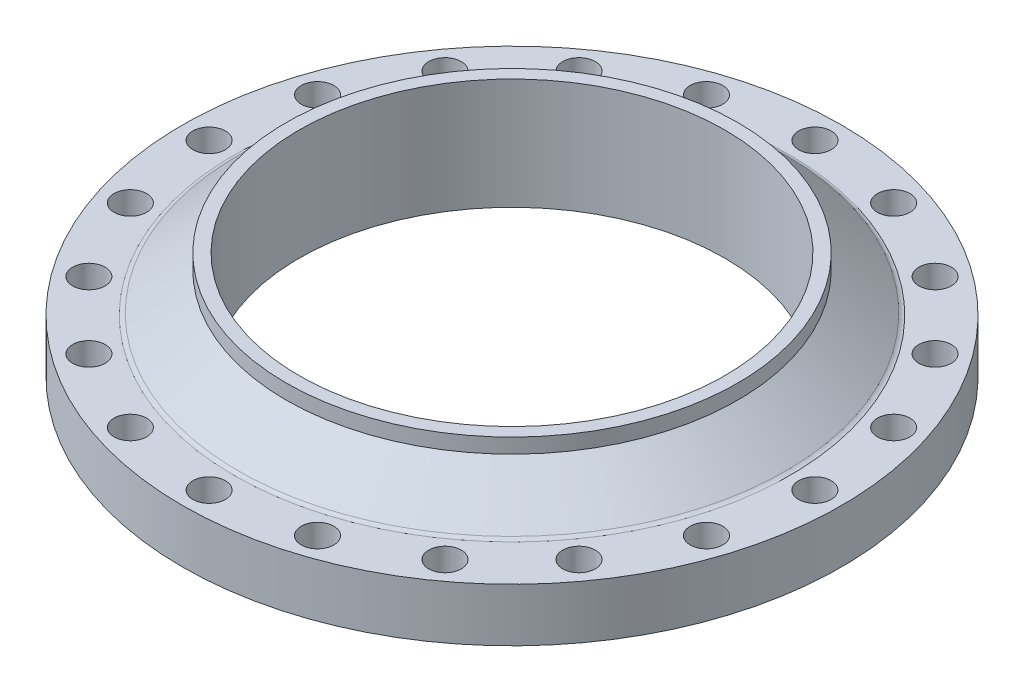
ISO-10303-21;
HEADER;
FILE_DESCRIPTION(('STEP AP214'),'2;1');
FILE_NAME('part.step','',(''),(''),'','','');
FILE_SCHEMA(('AUTOMOTIVE_DESIGN { 1 0 10303 214 1 1 1 1 }'));
ENDSEC;
DATA;
#1=APPLICATION_CONTEXT('core data for automotive mechanical design processes');
#2=APPLICATION_PROTOCOL_DEFINITION('international standard','automotive_design',2000,#1);
#3=PRODUCT_CONTEXT('',#1,'mechanical');
#4=PRODUCT('Part','Part','',(#3));
#5=PRODUCT_RELATED_PRODUCT_CATEGORY('part','',(#4));
#6=PRODUCT_DEFINITION_FORMATION('','',#4);
#7=PRODUCT_DEFINITION_CONTEXT('part definition',#1,'design');
#8=PRODUCT_DEFINITION('design','',#6,#7);
#9=PRODUCT_DEFINITION_SHAPE('','',#8);
#10=(LENGTH_UNIT() NAMED_UNIT(*) SI_UNIT(.MILLI.,.METRE.));
#11=(NAMED_UNIT(*) PLANE_ANGLE_UNIT() SI_UNIT($,.RADIAN.));
#12=(NAMED_UNIT(*) SI_UNIT($,.STERADIAN.) SOLID_ANGLE_UNIT());
#13=UNCERTAINTY_MEASURE_WITH_UNIT(LENGTH_MEASURE(1.E-05),#10,'distance_accuracy_value','');
#14=(GEOMETRIC_REPRESENTATION_CONTEXT(3) GLOBAL_UNCERTAINTY_ASSIGNED_CONTEXT((#13)) GLOBAL_UNIT_ASSIGNED_CONTEXT((#10,
#11,#12)) REPRESENTATION_CONTEXT('',''));
#15=CARTESIAN_POINT('',(0.,0.,0.));
#16=DIRECTION('',(0.,0.,1.));
#17=DIRECTION('',(1.,0.,0.));
#18=AXIS2_PLACEMENT_3D('',#15,#16,#17);
#19=CARTESIAN_POINT('',(-348.81739370403,77.,-2.43577884156304E-12));
#20=DIRECTION('',(0.,1.,0.));
#21=DIRECTION('',(0.,0.,1.));
#22=AXIS2_PLACEMENT_3D('',#19,#20,#21);
#23=PLANE('',#22);
#24=CARTESIAN_POINT('',(388.982115164719,77.,-126.387950699348));
#25=DIRECTION('',(0.,1.,0.));
#26=DIRECTION('',(0.,0.,1.));
#27=AXIS2_PLACEMENT_3D('',#24,#25,#26);
#28=CIRCLE('',#27,22.);
#29=CARTESIAN_POINT('',(388.982115164719,77.,-104.387950699348));
#30=VERTEX_POINT('',#29);
#31=EDGE_CURVE('E119',#30,#30,#28,.T.);
#32=ORIENTED_EDGE('',*,*,#31,.F.);
#33=EDGE_LOOP('',(#32));
#34=FACE_BOUND('',#33,.T.);
#35=CARTESIAN_POINT('',(330.887950699357,77.,-240.404168187617));
#36=DIRECTION('',(0.,1.,0.));
#37=DIRECTION('',(0.,0.,1.));
#38=AXIS2_PLACEMENT_3D('',#35,#36,#37);
#39=CIRCLE('',#38,22.);
#40=CARTESIAN_POINT('',(330.887950699357,77.,-218.404168187617));
#41=VERTEX_POINT('',#40);
#42=EDGE_CURVE('E116',#41,#41,#39,.T.);
#43=ORIENTED_EDGE('',*,*,#42,.F.);
#44=EDGE_LOOP('',(#43));
#45=FACE_BOUND('',#44,.T.);
#46=CARTESIAN_POINT('',(240.404168187626,77.,-330.88795069935));
#47=DIRECTION('',(0.,1.,0.));
#48=DIRECTION('',(0.,0.,1.));
#49=AXIS2_PLACEMENT_3D('',#46,#47,#48);
#50=CIRCLE('',#49,22.);
#51=CARTESIAN_POINT('',(240.404168187626,77.,-308.88795069935));
#52=VERTEX_POINT('',#51);
#53=EDGE_CURVE('E113',#52,#52,#50,.T.);
#54=ORIENTED_EDGE('',*,*,#53,.F.);
#55=EDGE_LOOP('',(#54));
#56=FACE_BOUND('',#55,.T.);
#57=CARTESIAN_POINT('',(126.387950699358,77.,-388.982115164716));
#58=DIRECTION('',(0.,1.,0.));
#59=DIRECTION('',(0.,0.,1.));
#60=AXIS2_PLACEMENT_3D('',#57,#58,#59);
#61=CIRCLE('',#60,22.);
#62=CARTESIAN_POINT('',(126.387950699358,77.,-366.982115164716));
#63=VERTEX_POINT('',#62);
#64=EDGE_CURVE('E109',#63,#63,#61,.T.);
#65=ORIENTED_EDGE('',*,*,#64,.F.);
#66=EDGE_LOOP('',(#65));
#67=FACE_BOUND('',#66,.T.);
#68=CARTESIAN_POINT('',(4.28404760276052E-12,77.,-409.));
#69=DIRECTION('',(0.,1.,0.));
#70=DIRECTION('',(0.,0.,1.));
#71=AXIS2_PLACEMENT_3D('',#68,#69,#70);
#72=CIRCLE('',#71,22.);
#73=CARTESIAN_POINT('',(4.28404760276052E-12,77.,-387.));
#74=VERTEX_POINT('',#73);
#75=EDGE_CURVE('E105',#74,#74,#72,.T.);
#76=ORIENTED_EDGE('',*,*,#75,.F.);
#77=EDGE_LOOP('',(#76));
#78=FACE_BOUND('',#77,.T.);
#79=CARTESIAN_POINT('',(-126.38795069935,77.,-388.982115164719));
#80=DIRECTION('',(0.,1.,0.));
#81=DIRECTION('',(0.,0.,1.));
#82=AXIS2_PLACEMENT_3D('',#79,#80,#81);
#83=CIRCLE('',#82,22.);
#84=CARTESIAN_POINT('',(-126.38795069935,77.,-366.982115164719));
#85=VERTEX_POINT('',#84);
#86=EDGE_CURVE('E101',#85,#85,#83,.T.);
#87=ORIENTED_EDGE('',*,*,#86,.F.);
#88=EDGE_LOOP('',(#87));
#89=FACE_BOUND('',#88,.T.);
#90=CARTESIAN_POINT('',(-240.404168187618,77.,-330.887950699356));
#91=DIRECTION('',(0.,1.,0.));
#92=DIRECTION('',(0.,0.,1.));
#93=AXIS2_PLACEMENT_3D('',#90,#91,#92);
#94=CIRCLE('',#93,22.);
#95=CARTESIAN_POINT('',(-240.404168187618,77.,-308.887950699356));
#96=VERTEX_POINT('',#95);
#97=EDGE_CURVE('E97',#96,#96,#94,.T.);
#98=ORIENTED_EDGE('',*,*,#97,.F.);
#99=EDGE_LOOP('',(#98));
#100=FACE_BOUND('',#99,.T.);
#101=CARTESIAN_POINT('',(-330.887950699351,77.,-240.404168187624));
#102=DIRECTION('',(0.,1.,0.));
#103=DIRECTION('',(0.,0.,1.));
#104=AXIS2_PLACEMENT_3D('',#101,#102,#103);
#105=CIRCLE('',#104,22.);
#106=CARTESIAN_POINT('',(-330.887950699351,77.,-218.404168187624));
#107=VERTEX_POINT('',#106);
#108=EDGE_CURVE('E93',#107,#107,#105,.T.);
#109=ORIENTED_EDGE('',*,*,#108,.F.);
#110=EDGE_LOOP('',(#109));
#111=FACE_BOUND('',#110,.T.);
#112=CARTESIAN_POINT('',(-388.982115164717,77.,-126.387950699357));
#113=DIRECTION('',(0.,1.,0.));
#114=DIRECTION('',(0.,0.,1.));
#115=AXIS2_PLACEMENT_3D('',#112,#113,#114);
#116=CIRCLE('',#115,22.);
#117=CARTESIAN_POINT('',(-388.982115164717,77.,-104.387950699357));
#118=VERTEX_POINT('',#117);
#119=EDGE_CURVE('E89',#118,#118,#116,.T.);
#120=ORIENTED_EDGE('',*,*,#119,.F.);
#121=EDGE_LOOP('',(#120));
#122=FACE_BOUND('',#121,.T.);
#123=CARTESIAN_POINT('',(-409.,77.,-2.85603173517368E-12));
#124=DIRECTION('',(0.,1.,0.));
#125=DIRECTION('',(0.,0.,1.));
#126=AXIS2_PLACEMENT_3D('',#123,#124,#125);
#127=CIRCLE('',#126,22.);
#128=CARTESIAN_POINT('',(-409.,77.,21.9999999999972));
#129=VERTEX_POINT('',#128);
#130=EDGE_CURVE('E85',#129,#129,#127,.T.);
#131=ORIENTED_EDGE('',*,*,#130,.F.);
#132=EDGE_LOOP('',(#131));
#133=FACE_BOUND('',#132,.T.);
#134=CARTESIAN_POINT('',(-388.982115164719,77.,126.387950699351));
#135=DIRECTION('',(0.,1.,0.));
#136=DIRECTION('',(0.,0.,1.));
#137=AXIS2_PLACEMENT_3D('',#134,#135,#136);
#138=CIRCLE('',#137,22.);
#139=CARTESIAN_POINT('',(-388.982115164719,77.,148.387950699351));
#140=VERTEX_POINT('',#139);
#141=EDGE_CURVE('E81',#140,#140,#138,.T.);
#142=ORIENTED_EDGE('',*,*,#141,.F.);
#143=EDGE_LOOP('',(#142));
#144=FACE_BOUND('',#143,.T.);
#145=CARTESIAN_POINT('',(-330.887950699355,77.,240.40416818762));
#146=DIRECTION('',(0.,1.,0.));
#147=DIRECTION('',(0.,0.,1.));
#148=AXIS2_PLACEMENT_3D('',#145,#146,#147);
#149=CIRCLE('',#148,22.);
#150=CARTESIAN_POINT('',(-330.887950699355,77.,262.40416818762));
#151=VERTEX_POINT('',#150);
#152=EDGE_CURVE('E77',#151,#151,#149,.T.);
#153=ORIENTED_EDGE('',*,*,#152,.F.);
#154=EDGE_LOOP('',(#153));
#155=FACE_BOUND('',#154,.T.);
#156=CARTESIAN_POINT('',(-240.404168187623,77.,330.887950699352));
#157=DIRECTION('',(0.,1.,0.));
#158=DIRECTION('',(0.,0.,1.));
#159=AXIS2_PLACEMENT_3D('',#156,#157,#158);
#160=CIRCLE('',#159,22.);
#161=CARTESIAN_POINT('',(-240.404168187623,77.,352.887950699352));
#162=VERTEX_POINT('',#161);
#163=EDGE_CURVE('E73',#162,#162,#160,.T.);
#164=ORIENTED_EDGE('',*,*,#163,.F.);
#165=EDGE_LOOP('',(#164));
#166=FACE_BOUND('',#165,.T.);
#167=CARTESIAN_POINT('',(-126.387950699355,77.,388.982115164717));
#168=DIRECTION('',(0.,1.,0.));
#169=DIRECTION('',(0.,0.,1.));
#170=AXIS2_PLACEMENT_3D('',#167,#168,#169);
#171=CIRCLE('',#170,22.);
#172=CARTESIAN_POINT('',(-126.387950699355,77.,410.982115164717));
#173=VERTEX_POINT('',#172);
#174=EDGE_CURVE('E69',#173,#173,#171,.T.);
#175=ORIENTED_EDGE('',*,*,#174,.F.);
#176=EDGE_LOOP('',(#175));
#177=FACE_BOUND('',#176,.T.);
#178=CARTESIAN_POINT('',(-1.42801586758684E-12,77.,409.));
#179=DIRECTION('',(0.,1.,0.));
#180=DIRECTION('',(0.,0.,1.));
#181=AXIS2_PLACEMENT_3D('',#178,#179,#180);
#182=CIRCLE('',#181,22.);
#183=CARTESIAN_POINT('',(-1.42801586758684E-12,77.,431.));
#184=VERTEX_POINT('',#183);
#185=EDGE_CURVE('E65',#184,#184,#182,.T.);
#186=ORIENTED_EDGE('',*,*,#185,.F.);
#187=EDGE_LOOP('',(#186));
#188=FACE_BOUND('',#187,.T.);
#189=CARTESIAN_POINT('',(126.387950699352,77.,388.982115164718));
#190=DIRECTION('',(0.,1.,0.));
#191=DIRECTION('',(0.,0.,1.));
#192=AXIS2_PLACEMENT_3D('',#189,#190,#191);
#193=CIRCLE('',#192,22.);
#194=CARTESIAN_POINT('',(126.387950699352,77.,410.982115164718));
#195=VERTEX_POINT('',#194);
#196=EDGE_CURVE('E61',#195,#195,#193,.T.);
#197=ORIENTED_EDGE('',*,*,#196,.F.);
#198=EDGE_LOOP('',(#197));
#199=FACE_BOUND('',#198,.T.);
#200=CARTESIAN_POINT('',(240.404168187621,77.,330.887950699354));
#201=DIRECTION('',(0.,1.,0.));
#202=DIRECTION('',(0.,0.,1.));
#203=AXIS2_PLACEMENT_3D('',#200,#201,#202);
#204=CIRCLE('',#203,22.);
#205=CARTESIAN_POINT('',(240.404168187621,77.,352.887950699354));
#206=VERTEX_POINT('',#205);
#207=EDGE_CURVE('E57',#206,#206,#204,.T.);
#208=ORIENTED_EDGE('',*,*,#207,.F.);
#209=EDGE_LOOP('',(#208));
#210=FACE_BOUND('',#209,.T.);
#211=CARTESIAN_POINT('',(330.887950699353,77.,240.404168187622));
#212=DIRECTION('',(0.,1.,0.));
#213=DIRECTION('',(0.,0.,1.));
#214=AXIS2_PLACEMENT_3D('',#211,#212,#213);
#215=CIRCLE('',#214,22.);
#216=CARTESIAN_POINT('',(330.887950699353,77.,262.404168187622));
#217=VERTEX_POINT('',#216);
#218=EDGE_CURVE('E53',#217,#217,#215,.T.);
#219=ORIENTED_EDGE('',*,*,#218,.F.);
#220=EDGE_LOOP('',(#219));
#221=FACE_BOUND('',#220,.T.);
#222=CARTESIAN_POINT('',(388.982115164718,77.,126.387950699354));
#223=DIRECTION('',(0.,1.,0.));
#224=DIRECTION('',(0.,0.,1.));
#225=AXIS2_PLACEMENT_3D('',#222,#223,#224);
#226=CIRCLE('',#225,22.);
#227=CARTESIAN_POINT('',(388.982115164718,77.,148.387950699354));
#228=VERTEX_POINT('',#227);
#229=EDGE_CURVE('E49',#228,#228,#226,.T.);
#230=ORIENTED_EDGE('',*,*,#229,.F.);
#231=EDGE_LOOP('',(#230));
#232=FACE_BOUND('',#231,.T.);
#233=CARTESIAN_POINT('',(409.,77.,0.));
#234=DIRECTION('',(0.,1.,0.));
#235=DIRECTION('',(0.,0.,1.));
#236=AXIS2_PLACEMENT_3D('',#233,#234,#235);
#237=CIRCLE('',#236,22.);
#238=CARTESIAN_POINT('',(409.,77.,22.));
#239=VERTEX_POINT('',#238);
#240=EDGE_CURVE('E48',#239,#239,#237,.T.);
#241=ORIENTED_EDGE('',*,*,#240,.F.);
#242=EDGE_LOOP('',(#241));
#243=FACE_BOUND('',#242,.T.);
#244=CARTESIAN_POINT('',(0.,77.,0.));
#245=DIRECTION('',(0.,-1.,0.));
#246=DIRECTION('',(0.,0.,-1.));
#247=AXIS2_PLACEMENT_3D('',#244,#245,#246);
#248=CIRCLE('',#247,375.);
#249=CARTESIAN_POINT('',(0.,77.,-375.));
#250=VERTEX_POINT('',#249);
#251=EDGE_CURVE('E10',#250,#250,#248,.T.);
#252=ORIENTED_EDGE('',*,*,#251,.T.);
#253=EDGE_LOOP('',(#252));
#254=FACE_BOUND('',#253,.T.);
#255=CARTESIAN_POINT('',(0.,77.,0.));
#256=DIRECTION('',(0.,-1.,0.));
#257=DIRECTION('',(0.,0.,-1.));
#258=AXIS2_PLACEMENT_3D('',#255,#256,#257);
#259=CIRCLE('',#258,445.);
#260=CARTESIAN_POINT('',(0.,77.,-445.));
#261=VERTEX_POINT('',#260);
#262=EDGE_CURVE('E166',#261,#261,#259,.T.);
#263=ORIENTED_EDGE('',*,*,#262,.F.);
#264=EDGE_LOOP('',(#263));
#265=FACE_BOUND('',#264,.T.);
#266=ADVANCED_FACE('F29',(#34,#45,#56,#67,#78,#89,#100,#111,#122,#133,#144,#155,#166,#177,#188,
#199,#210,#221,#232,#243,#254,#265),#23,.T.);
#267=CARTESIAN_POINT('',(0.,88.8743835950894,0.));
#268=DIRECTION('',(0.,-1.,0.));
#269=DIRECTION('',(0.,0.,-1.));
#270=AXIS2_PLACEMENT_3D('',#267,#268,#269);
#271=TOROIDAL_SURFACE('',#270,376.731766218827,12.);
#272=CARTESIAN_POINT('',(0.,79.4292405892214,0.));
#273=DIRECTION('',(0.,-1.,0.));
#274=DIRECTION('',(0.,0.,-1.));
#275=AXIS2_PLACEMENT_3D('',#272,#273,#274);
#276=CIRCLE('',#275,369.329788537241);
#277=CARTESIAN_POINT('',(0.,79.4292405892214,-369.329788537241));
#278=VERTEX_POINT('',#277);
#279=EDGE_CURVE('E36',#278,#278,#276,.T.);
#280=ORIENTED_EDGE('',*,*,#279,.T.);
#281=EDGE_LOOP('',(#280));
#282=FACE_BOUND('',#281,.T.);
#283=ORIENTED_EDGE('',*,*,#251,.F.);
#284=EDGE_LOOP('',(#283));
#285=FACE_BOUND('',#284,.T.);
#286=ADVANCED_FACE('F221',(#282,#285),#271,.F.);
#287=CARTESIAN_POINT('',(0.,130.,0.));
#288=DIRECTION('',(0.,-1.,0.));
#289=DIRECTION('',(0.,0.,-1.));
#290=AXIS2_PLACEMENT_3D('',#287,#288,#289);
#291=CONICAL_SURFACE('',#290,304.8,0.90608559937454);
#292=ORIENTED_EDGE('',*,*,#279,.F.);
#293=EDGE_LOOP('',(#292));
#294=FACE_BOUND('',#293,.T.);
#295=CARTESIAN_POINT('',(0.,130.,0.));
#296=DIRECTION('',(0.,-1.,0.));
#297=DIRECTION('',(0.,0.,-1.));
#298=AXIS2_PLACEMENT_3D('',#295,#296,#297);
#299=CIRCLE('',#298,304.8);
#300=CARTESIAN_POINT('',(0.,130.,-304.8));
#301=VERTEX_POINT('',#300);
#302=EDGE_CURVE('E41',#301,#301,#299,.T.);
#303=ORIENTED_EDGE('',*,*,#302,.T.);
#304=EDGE_LOOP('',(#303));
#305=FACE_BOUND('',#304,.T.);
#306=ADVANCED_FACE('F189',(#294,#305),#291,.T.);
#307=CARTESIAN_POINT('',(0.,92.0971254355401,0.));
#308=DIRECTION('',(0.,-1.,0.));
#309=DIRECTION('',(0.,0.,-1.));
#310=AXIS2_PLACEMENT_3D('',#307,#308,#309);
#311=CYLINDRICAL_SURFACE('',#310,304.8);
#312=ORIENTED_EDGE('',*,*,#302,.F.);
#313=EDGE_LOOP('',(#312));
#314=FACE_BOUND('',#313,.T.);
#315=CARTESIAN_POINT('',(0.,150.,0.));
#316=DIRECTION('',(0.,-1.,0.));
#317=DIRECTION('',(0.,0.,-1.));
#318=AXIS2_PLACEMENT_3D('',#315,#316,#317);
#319=CIRCLE('',#318,304.8);
#320=CARTESIAN_POINT('',(0.,150.,-304.8));
#321=VERTEX_POINT('',#320);
#322=EDGE_CURVE('E184',#321,#321,#319,.T.);
#323=ORIENTED_EDGE('',*,*,#322,.T.);
#324=EDGE_LOOP('',(#323));
#325=FACE_BOUND('',#324,.T.);
#326=ADVANCED_FACE('F191',(#314,#325),#311,.T.);
#327=CARTESIAN_POINT('',(-348.81739370403,150.,-2.43577884156304E-12));
#328=DIRECTION('',(0.,-1.,0.));
#329=DIRECTION('',(0.,0.,-1.));
#330=AXIS2_PLACEMENT_3D('',#327,#328,#329);
#331=PLANE('',#330);
#332=ORIENTED_EDGE('',*,*,#322,.F.);
#333=EDGE_LOOP('',(#332));
#334=FACE_BOUND('',#333,.T.);
#335=CARTESIAN_POINT('',(0.,150.,0.));
#336=DIRECTION('',(0.,-1.,0.));
#337=DIRECTION('',(0.,0.,-1.));
#338=AXIS2_PLACEMENT_3D('',#335,#336,#337);
#339=CIRCLE('',#338,287.4);
#340=CARTESIAN_POINT('',(0.,150.,-287.4));
#341=VERTEX_POINT('',#340);
#342=EDGE_CURVE('E181',#341,#341,#339,.T.);
#343=ORIENTED_EDGE('',*,*,#342,.T.);
#344=EDGE_LOOP('',(#343));
#345=FACE_BOUND('',#344,.T.);
#346=ADVANCED_FACE('F194',(#334,#345),#331,.F.);
#347=CARTESIAN_POINT('',(0.,92.0971254355401,0.));
#348=DIRECTION('',(0.,-1.,0.));
#349=DIRECTION('',(0.,0.,-1.));
#350=AXIS2_PLACEMENT_3D('',#347,#348,#349);
#351=CYLINDRICAL_SURFACE('',#350,287.4);
#352=ORIENTED_EDGE('',*,*,#342,.F.);
#353=EDGE_LOOP('',(#352));
#354=FACE_BOUND('',#353,.T.);
#355=CARTESIAN_POINT('',(0.,0.,0.));
#356=DIRECTION('',(0.,-1.,0.));
#357=DIRECTION('',(0.,0.,-1.));
#358=AXIS2_PLACEMENT_3D('',#355,#356,#357);
#359=CIRCLE('',#358,287.4);
#360=CARTESIAN_POINT('',(0.,0.,-287.4));
#361=VERTEX_POINT('',#360);
#362=EDGE_CURVE('E178',#361,#361,#359,.T.);
#363=ORIENTED_EDGE('',*,*,#362,.T.);
#364=EDGE_LOOP('',(#363));
#365=FACE_BOUND('',#364,.T.);
#366=ADVANCED_FACE('F200',(#354,#365),#351,.F.);
#367=CARTESIAN_POINT('',(-348.81739370403,0.,-2.43577884156304E-12));
#368=DIRECTION('',(0.,-1.,0.));
#369=DIRECTION('',(0.,0.,-1.));
#370=AXIS2_PLACEMENT_3D('',#367,#368,#369);
#371=PLANE('',#370);
#372=CARTESIAN_POINT('',(0.,0.,0.));
#373=DIRECTION('',(0.,-1.,0.));
#374=DIRECTION('',(0.,0.,-1.));
#375=AXIS2_PLACEMENT_3D('',#372,#373,#374);
#376=CIRCLE('',#375,370.);
#377=CARTESIAN_POINT('',(0.,0.,-370.));
#378=VERTEX_POINT('',#377);
#379=EDGE_CURVE('E175',#378,#378,#376,.T.);
#380=ORIENTED_EDGE('',*,*,#379,.T.);
#381=EDGE_LOOP('',(#380));
#382=FACE_BOUND('',#381,.T.);
#383=ORIENTED_EDGE('',*,*,#362,.F.);
#384=EDGE_LOOP('',(#383));
#385=FACE_BOUND('',#384,.T.);
#386=ADVANCED_FACE('F206',(#382,#385),#371,.T.);
#387=CARTESIAN_POINT('',(0.,0.,0.));
#388=DIRECTION('',(0.,1.,0.));
#389=DIRECTION('',(0.,0.,1.));
#390=AXIS2_PLACEMENT_3D('',#387,#388,#389);
#391=CONICAL_SURFACE('',#390,370.,0.78539816339745);
#392=CARTESIAN_POINT('',(0.,4.99999999999999,0.));
#393=DIRECTION('',(0.,-1.,0.));
#394=DIRECTION('',(0.,0.,-1.));
#395=AXIS2_PLACEMENT_3D('',#392,#393,#394);
#396=CIRCLE('',#395,375.);
#397=CARTESIAN_POINT('',(0.,4.99999999999999,-375.));
#398=VERTEX_POINT('',#397);
#399=EDGE_CURVE('E172',#398,#398,#396,.T.);
#400=ORIENTED_EDGE('',*,*,#399,.T.);
#401=EDGE_LOOP('',(#400));
#402=FACE_BOUND('',#401,.T.);
#403=ORIENTED_EDGE('',*,*,#379,.F.);
#404=EDGE_LOOP('',(#403));
#405=FACE_BOUND('',#404,.T.);
#406=ADVANCED_FACE('F211',(#402,#405),#391,.T.);
#407=CARTESIAN_POINT('',(-348.81739370403,5.,-2.43577884156304E-12));
#408=DIRECTION('',(0.,-1.,0.));
#409=DIRECTION('',(0.,0.,-1.));
#410=AXIS2_PLACEMENT_3D('',#407,#408,#409);
#411=PLANE('',#410);
#412=CARTESIAN_POINT('',(388.982115164719,5.,-126.387950699348));
#413=DIRECTION('',(0.,-1.,0.));
#414=DIRECTION('',(0.,0.,-1.));
#415=AXIS2_PLACEMENT_3D('',#412,#413,#414);
#416=CIRCLE('',#415,22.);
#417=CARTESIAN_POINT('',(388.982115164719,5.,-148.387950699348));
#418=VERTEX_POINT('',#417);
#419=EDGE_CURVE('E32',#418,#418,#416,.T.);
#420=ORIENTED_EDGE('',*,*,#419,.F.);
#421=EDGE_LOOP('',(#420));
#422=FACE_BOUND('',#421,.T.);
#423=CARTESIAN_POINT('',(330.887950699357,5.,-240.404168187617));
#424=DIRECTION('',(0.,-1.,0.));
#425=DIRECTION('',(0.,0.,-1.));
#426=AXIS2_PLACEMENT_3D('',#423,#424,#425);
#427=CIRCLE('',#426,22.);
#428=CARTESIAN_POINT('',(330.887950699357,5.,-262.404168187617));
#429=VERTEX_POINT('',#428);
#430=EDGE_CURVE('E117',#429,#429,#427,.T.);
#431=ORIENTED_EDGE('',*,*,#430,.F.);
#432=EDGE_LOOP('',(#431));
#433=FACE_BOUND('',#432,.T.);
#434=CARTESIAN_POINT('',(240.404168187626,5.,-330.88795069935));
#435=DIRECTION('',(0.,-1.,0.));
#436=DIRECTION('',(0.,0.,-1.));
#437=AXIS2_PLACEMENT_3D('',#434,#435,#436);
#438=CIRCLE('',#437,22.);
#439=CARTESIAN_POINT('',(240.404168187626,5.,-352.887950699351));
#440=VERTEX_POINT('',#439);
#441=EDGE_CURVE('E114',#440,#440,#438,.T.);
#442=ORIENTED_EDGE('',*,*,#441,.F.);
#443=EDGE_LOOP('',(#442));
#444=FACE_BOUND('',#443,.T.);
#445=CARTESIAN_POINT('',(126.387950699358,5.,-388.982115164716));
#446=DIRECTION('',(0.,-1.,0.));
#447=DIRECTION('',(0.,0.,-1.));
#448=AXIS2_PLACEMENT_3D('',#445,#446,#447);
#449=CIRCLE('',#448,22.);
#450=CARTESIAN_POINT('',(126.387950699358,5.,-410.982115164716));
#451=VERTEX_POINT('',#450);
#452=EDGE_CURVE('E110',#451,#451,#449,.T.);
#453=ORIENTED_EDGE('',*,*,#452,.F.);
#454=EDGE_LOOP('',(#453));
#455=FACE_BOUND('',#454,.T.);
#456=CARTESIAN_POINT('',(4.28404760276052E-12,5.,-409.));
#457=DIRECTION('',(0.,-1.,0.));
#458=DIRECTION('',(0.,0.,-1.));
#459=AXIS2_PLACEMENT_3D('',#456,#457,#458);
#460=CIRCLE('',#459,22.);
#461=CARTESIAN_POINT('',(4.28404760276052E-12,5.,-431.));
#462=VERTEX_POINT('',#461);
#463=EDGE_CURVE('E106',#462,#462,#460,.T.);
#464=ORIENTED_EDGE('',*,*,#463,.F.);
#465=EDGE_LOOP('',(#464));
#466=FACE_BOUND('',#465,.T.);
#467=CARTESIAN_POINT('',(-126.38795069935,5.,-388.982115164719));
#468=DIRECTION('',(0.,-1.,0.));
#469=DIRECTION('',(0.,0.,-1.));
#470=AXIS2_PLACEMENT_3D('',#467,#468,#469);
#471=CIRCLE('',#470,22.);
#472=CARTESIAN_POINT('',(-126.38795069935,5.,-410.982115164719));
#473=VERTEX_POINT('',#472);
#474=EDGE_CURVE('E102',#473,#473,#471,.T.);
#475=ORIENTED_EDGE('',*,*,#474,.F.);
#476=EDGE_LOOP('',(#475));
#477=FACE_BOUND('',#476,.T.);
#478=CARTESIAN_POINT('',(-240.404168187618,5.,-330.887950699356));
#479=DIRECTION('',(0.,-1.,0.));
#480=DIRECTION('',(0.,0.,-1.));
#481=AXIS2_PLACEMENT_3D('',#478,#479,#480);
#482=CIRCLE('',#481,22.);
#483=CARTESIAN_POINT('',(-240.404168187618,5.,-352.887950699356));
#484=VERTEX_POINT('',#483);
#485=EDGE_CURVE('E98',#484,#484,#482,.T.);
#486=ORIENTED_EDGE('',*,*,#485,.F.);
#487=EDGE_LOOP('',(#486));
#488=FACE_BOUND('',#487,.T.);
#489=CARTESIAN_POINT('',(-330.887950699351,5.,-240.404168187624));
#490=DIRECTION('',(0.,-1.,0.));
#491=DIRECTION('',(0.,0.,-1.));
#492=AXIS2_PLACEMENT_3D('',#489,#490,#491);
#493=CIRCLE('',#492,22.);
#494=CARTESIAN_POINT('',(-330.887950699351,5.,-262.404168187624));
#495=VERTEX_POINT('',#494);
#496=EDGE_CURVE('E94',#495,#495,#493,.T.);
#497=ORIENTED_EDGE('',*,*,#496,.F.);
#498=EDGE_LOOP('',(#497));
#499=FACE_BOUND('',#498,.T.);
#500=CARTESIAN_POINT('',(-388.982115164717,5.,-126.387950699357));
#501=DIRECTION('',(0.,-1.,0.));
#502=DIRECTION('',(0.,0.,-1.));
#503=AXIS2_PLACEMENT_3D('',#500,#501,#502);
#504=CIRCLE('',#503,22.);
#505=CARTESIAN_POINT('',(-388.982115164717,5.,-148.387950699357));
#506=VERTEX_POINT('',#505);
#507=EDGE_CURVE('E90',#506,#506,#504,.T.);
#508=ORIENTED_EDGE('',*,*,#507,.F.);
#509=EDGE_LOOP('',(#508));
#510=FACE_BOUND('',#509,.T.);
#511=CARTESIAN_POINT('',(-409.,5.,-2.85603173517368E-12));
#512=DIRECTION('',(0.,-1.,0.));
#513=DIRECTION('',(0.,0.,-1.));
#514=AXIS2_PLACEMENT_3D('',#511,#512,#513);
#515=CIRCLE('',#514,22.);
#516=CARTESIAN_POINT('',(-409.,5.,-22.0000000000029));
#517=VERTEX_POINT('',#516);
#518=EDGE_CURVE('E86',#517,#517,#515,.T.);
#519=ORIENTED_EDGE('',*,*,#518,.F.);
#520=EDGE_LOOP('',(#519));
#521=FACE_BOUND('',#520,.T.);
#522=CARTESIAN_POINT('',(-388.982115164719,5.,126.387950699351));
#523=DIRECTION('',(0.,-1.,0.));
#524=DIRECTION('',(0.,0.,-1.));
#525=AXIS2_PLACEMENT_3D('',#522,#523,#524);
#526=CIRCLE('',#525,22.);
#527=CARTESIAN_POINT('',(-388.982115164719,5.,104.387950699351));
#528=VERTEX_POINT('',#527);
#529=EDGE_CURVE('E82',#528,#528,#526,.T.);
#530=ORIENTED_EDGE('',*,*,#529,.F.);
#531=EDGE_LOOP('',(#530));
#532=FACE_BOUND('',#531,.T.);
#533=CARTESIAN_POINT('',(-330.887950699355,5.,240.40416818762));
#534=DIRECTION('',(0.,-1.,0.));
#535=DIRECTION('',(0.,0.,-1.));
#536=AXIS2_PLACEMENT_3D('',#533,#534,#535);
#537=CIRCLE('',#536,22.);
#538=CARTESIAN_POINT('',(-330.887950699355,5.,218.40416818762));
#539=VERTEX_POINT('',#538);
#540=EDGE_CURVE('E78',#539,#539,#537,.T.);
#541=ORIENTED_EDGE('',*,*,#540,.F.);
#542=EDGE_LOOP('',(#541));
#543=FACE_BOUND('',#542,.T.);
#544=CARTESIAN_POINT('',(-240.404168187623,5.,330.887950699352));
#545=DIRECTION('',(0.,-1.,0.));
#546=DIRECTION('',(0.,0.,-1.));
#547=AXIS2_PLACEMENT_3D('',#544,#545,#546);
#548=CIRCLE('',#547,22.);
#549=CARTESIAN_POINT('',(-240.404168187623,5.,308.887950699352));
#550=VERTEX_POINT('',#549);
#551=EDGE_CURVE('E74',#550,#550,#548,.T.);
#552=ORIENTED_EDGE('',*,*,#551,.F.);
#553=EDGE_LOOP('',(#552));
#554=FACE_BOUND('',#553,.T.);
#555=CARTESIAN_POINT('',(-126.387950699355,5.,388.982115164717));
#556=DIRECTION('',(0.,-1.,0.));
#557=DIRECTION('',(0.,0.,-1.));
#558=AXIS2_PLACEMENT_3D('',#555,#556,#557);
#559=CIRCLE('',#558,22.);
#560=CARTESIAN_POINT('',(-126.387950699355,5.,366.982115164717));
#561=VERTEX_POINT('',#560);
#562=EDGE_CURVE('E70',#561,#561,#559,.T.);
#563=ORIENTED_EDGE('',*,*,#562,.F.);
#564=EDGE_LOOP('',(#563));
#565=FACE_BOUND('',#564,.T.);
#566=CARTESIAN_POINT('',(-1.42801586758684E-12,5.,409.));
#567=DIRECTION('',(0.,-1.,0.));
#568=DIRECTION('',(0.,0.,-1.));
#569=AXIS2_PLACEMENT_3D('',#566,#567,#568);
#570=CIRCLE('',#569,22.);
#571=CARTESIAN_POINT('',(-1.42801586758684E-12,5.,387.));
#572=VERTEX_POINT('',#571);
#573=EDGE_CURVE('E66',#572,#572,#570,.T.);
#574=ORIENTED_EDGE('',*,*,#573,.F.);
#575=EDGE_LOOP('',(#574));
#576=FACE_BOUND('',#575,.T.);
#577=CARTESIAN_POINT('',(126.387950699352,5.,388.982115164718));
#578=DIRECTION('',(0.,-1.,0.));
#579=DIRECTION('',(0.,0.,-1.));
#580=AXIS2_PLACEMENT_3D('',#577,#578,#579);
#581=CIRCLE('',#580,22.);
#582=CARTESIAN_POINT('',(126.387950699352,5.,366.982115164718));
#583=VERTEX_POINT('',#582);
#584=EDGE_CURVE('E62',#583,#583,#581,.T.);
#585=ORIENTED_EDGE('',*,*,#584,.F.);
#586=EDGE_LOOP('',(#585));
#587=FACE_BOUND('',#586,.T.);
#588=CARTESIAN_POINT('',(240.404168187621,5.,330.887950699354));
#589=DIRECTION('',(0.,-1.,0.));
#590=DIRECTION('',(0.,0.,-1.));
#591=AXIS2_PLACEMENT_3D('',#588,#589,#590);
#592=CIRCLE('',#591,22.);
#593=CARTESIAN_POINT('',(240.404168187621,5.,308.887950699354));
#594=VERTEX_POINT('',#593);
#595=EDGE_CURVE('E58',#594,#594,#592,.T.);
#596=ORIENTED_EDGE('',*,*,#595,.F.);
#597=EDGE_LOOP('',(#596));
#598=FACE_BOUND('',#597,.T.);
#599=CARTESIAN_POINT('',(330.887950699353,5.,240.404168187622));
#600=DIRECTION('',(0.,-1.,0.));
#601=DIRECTION('',(0.,0.,-1.));
#602=AXIS2_PLACEMENT_3D('',#599,#600,#601);
#603=CIRCLE('',#602,22.);
#604=CARTESIAN_POINT('',(330.887950699353,5.,218.404168187622));
#605=VERTEX_POINT('',#604);
#606=EDGE_CURVE('E54',#605,#605,#603,.T.);
#607=ORIENTED_EDGE('',*,*,#606,.F.);
#608=EDGE_LOOP('',(#607));
#609=FACE_BOUND('',#608,.T.);
#610=CARTESIAN_POINT('',(388.982115164718,5.,126.387950699354));
#611=DIRECTION('',(0.,-1.,0.));
#612=DIRECTION('',(0.,0.,-1.));
#613=AXIS2_PLACEMENT_3D('',#610,#611,#612);
#614=CIRCLE('',#613,22.);
#615=CARTESIAN_POINT('',(388.982115164718,5.,104.387950699354));
#616=VERTEX_POINT('',#615);
#617=EDGE_CURVE('E50',#616,#616,#614,.T.);
#618=ORIENTED_EDGE('',*,*,#617,.F.);
#619=EDGE_LOOP('',(#618));
#620=FACE_BOUND('',#619,.T.);
#621=CARTESIAN_POINT('',(409.,5.,0.));
#622=DIRECTION('',(0.,-1.,0.));
#623=DIRECTION('',(0.,0.,-1.));
#624=AXIS2_PLACEMENT_3D('',#621,#622,#623);
#625=CIRCLE('',#624,22.);
#626=CARTESIAN_POINT('',(409.,5.,-22.));
#627=VERTEX_POINT('',#626);
#628=EDGE_CURVE('E45',#627,#627,#625,.T.);
#629=ORIENTED_EDGE('',*,*,#628,.F.);
#630=EDGE_LOOP('',(#629));
#631=FACE_BOUND('',#630,.T.);
#632=CARTESIAN_POINT('',(0.,5.,0.));
#633=DIRECTION('',(0.,-1.,0.));
#634=DIRECTION('',(0.,0.,-1.));
#635=AXIS2_PLACEMENT_3D('',#632,#633,#634);
#636=CIRCLE('',#635,445.);
#637=CARTESIAN_POINT('',(0.,5.,-445.));
#638=VERTEX_POINT('',#637);
#639=EDGE_CURVE('E169',#638,#638,#636,.T.);
#640=ORIENTED_EDGE('',*,*,#639,.T.);
#641=EDGE_LOOP('',(#640));
#642=FACE_BOUND('',#641,.T.);
#643=ORIENTED_EDGE('',*,*,#399,.F.);
#644=EDGE_LOOP('',(#643));
#645=FACE_BOUND('',#644,.T.);
#646=ADVANCED_FACE('F217',(#422,#433,#444,#455,#466,#477,#488,#499,#510,#521,#532,#543,#554,
#565,#576,#587,#598,#609,#620,#631,#642,#645),#411,.T.);
#647=CARTESIAN_POINT('',(0.,92.0971254355401,0.));
#648=DIRECTION('',(0.,-1.,0.));
#649=DIRECTION('',(0.,0.,-1.));
#650=AXIS2_PLACEMENT_3D('',#647,#648,#649);
#651=CYLINDRICAL_SURFACE('',#650,445.);
#652=ORIENTED_EDGE('',*,*,#262,.T.);
#653=EDGE_LOOP('',(#652));
#654=FACE_BOUND('',#653,.T.);
#655=ORIENTED_EDGE('',*,*,#639,.F.);
#656=EDGE_LOOP('',(#655));
#657=FACE_BOUND('',#656,.T.);
#658=ADVANCED_FACE('F268',(#654,#657),#651,.T.);
#659=CARTESIAN_POINT('',(409.,-270.,0.));
#660=DIRECTION('',(0.,1.,0.));
#661=DIRECTION('',(0.,0.,1.));
#662=AXIS2_PLACEMENT_3D('',#659,#660,#661);
#663=CYLINDRICAL_SURFACE('',#662,22.);
#664=ORIENTED_EDGE('',*,*,#240,.T.);
#665=EDGE_LOOP('',(#664));
#666=FACE_BOUND('',#665,.T.);
#667=ORIENTED_EDGE('',*,*,#628,.T.);
#668=EDGE_LOOP('',(#667));
#669=FACE_BOUND('',#668,.T.);
#670=ADVANCED_FACE('F271',(#666,#669),#663,.F.);
#671=CARTESIAN_POINT('',(388.982115164718,-270.,126.387950699354));
#672=DIRECTION('',(0.,1.,0.));
#673=DIRECTION('',(0.,0.,1.));
#674=AXIS2_PLACEMENT_3D('',#671,#672,#673);
#675=CYLINDRICAL_SURFACE('',#674,22.);
#676=ORIENTED_EDGE('',*,*,#229,.T.);
#677=EDGE_LOOP('',(#676));
#678=FACE_BOUND('',#677,.T.);
#679=ORIENTED_EDGE('',*,*,#617,.T.);
#680=EDGE_LOOP('',(#679));
#681=FACE_BOUND('',#680,.T.);
#682=ADVANCED_FACE('F289',(#678,#681),#675,.F.);
#683=CARTESIAN_POINT('',(330.887950699353,-270.,240.404168187622));
#684=DIRECTION('',(0.,1.,0.));
#685=DIRECTION('',(0.,0.,1.));
#686=AXIS2_PLACEMENT_3D('',#683,#684,#685);
#687=CYLINDRICAL_SURFACE('',#686,22.);
#688=ORIENTED_EDGE('',*,*,#218,.T.);
#689=EDGE_LOOP('',(#688));
#690=FACE_BOUND('',#689,.T.);
#691=ORIENTED_EDGE('',*,*,#606,.T.);
#692=EDGE_LOOP('',(#691));
#693=FACE_BOUND('',#692,.T.);
#694=ADVANCED_FACE('F293',(#690,#693),#687,.F.);
#695=CARTESIAN_POINT('',(240.404168187621,-270.,330.887950699354));
#696=DIRECTION('',(0.,1.,0.));
#697=DIRECTION('',(0.,0.,1.));
#698=AXIS2_PLACEMENT_3D('',#695,#696,#697);
#699=CYLINDRICAL_SURFACE('',#698,22.);
#700=ORIENTED_EDGE('',*,*,#207,.T.);
#701=EDGE_LOOP('',(#700));
#702=FACE_BOUND('',#701,.T.);
#703=ORIENTED_EDGE('',*,*,#595,.T.);
#704=EDGE_LOOP('',(#703));
#705=FACE_BOUND('',#704,.T.);
#706=ADVANCED_FACE('F297',(#702,#705),#699,.F.);
#707=CARTESIAN_POINT('',(126.387950699352,-270.,388.982115164718));
#708=DIRECTION('',(0.,1.,0.));
#709=DIRECTION('',(0.,0.,1.));
#710=AXIS2_PLACEMENT_3D('',#707,#708,#709);
#711=CYLINDRICAL_SURFACE('',#710,22.);
#712=ORIENTED_EDGE('',*,*,#196,.T.);
#713=EDGE_LOOP('',(#712));
#714=FACE_BOUND('',#713,.T.);
#715=ORIENTED_EDGE('',*,*,#584,.T.);
#716=EDGE_LOOP('',(#715));
#717=FACE_BOUND('',#716,.T.);
#718=ADVANCED_FACE('F301',(#714,#717),#711,.F.);
#719=CARTESIAN_POINT('',(-1.42801586758684E-12,-270.,409.));
#720=DIRECTION('',(0.,1.,0.));
#721=DIRECTION('',(0.,0.,1.));
#722=AXIS2_PLACEMENT_3D('',#719,#720,#721);
#723=CYLINDRICAL_SURFACE('',#722,22.);
#724=ORIENTED_EDGE('',*,*,#185,.T.);
#725=EDGE_LOOP('',(#724));
#726=FACE_BOUND('',#725,.T.);
#727=ORIENTED_EDGE('',*,*,#573,.T.);
#728=EDGE_LOOP('',(#727));
#729=FACE_BOUND('',#728,.T.);
#730=ADVANCED_FACE('F305',(#726,#729),#723,.F.);
#731=CARTESIAN_POINT('',(-126.387950699355,-270.,388.982115164717));
#732=DIRECTION('',(0.,1.,0.));
#733=DIRECTION('',(0.,0.,1.));
#734=AXIS2_PLACEMENT_3D('',#731,#732,#733);
#735=CYLINDRICAL_SURFACE('',#734,22.);
#736=ORIENTED_EDGE('',*,*,#174,.T.);
#737=EDGE_LOOP('',(#736));
#738=FACE_BOUND('',#737,.T.);
#739=ORIENTED_EDGE('',*,*,#562,.T.);
#740=EDGE_LOOP('',(#739));
#741=FACE_BOUND('',#740,.T.);
#742=ADVANCED_FACE('F309',(#738,#741),#735,.F.);
#743=CARTESIAN_POINT('',(-240.404168187623,-270.,330.887950699352));
#744=DIRECTION('',(0.,1.,0.));
#745=DIRECTION('',(0.,0.,1.));
#746=AXIS2_PLACEMENT_3D('',#743,#744,#745);
#747=CYLINDRICAL_SURFACE('',#746,22.);
#748=ORIENTED_EDGE('',*,*,#163,.T.);
#749=EDGE_LOOP('',(#748));
#750=FACE_BOUND('',#749,.T.);
#751=ORIENTED_EDGE('',*,*,#551,.T.);
#752=EDGE_LOOP('',(#751));
#753=FACE_BOUND('',#752,.T.);
#754=ADVANCED_FACE('F313',(#750,#753),#747,.F.);
#755=CARTESIAN_POINT('',(-330.887950699355,-270.,240.40416818762));
#756=DIRECTION('',(0.,1.,0.));
#757=DIRECTION('',(0.,0.,1.));
#758=AXIS2_PLACEMENT_3D('',#755,#756,#757);
#759=CYLINDRICAL_SURFACE('',#758,22.);
#760=ORIENTED_EDGE('',*,*,#152,.T.);
#761=EDGE_LOOP('',(#760));
#762=FACE_BOUND('',#761,.T.);
#763=ORIENTED_EDGE('',*,*,#540,.T.);
#764=EDGE_LOOP('',(#763));
#765=FACE_BOUND('',#764,.T.);
#766=ADVANCED_FACE('F317',(#762,#765),#759,.F.);
#767=CARTESIAN_POINT('',(-388.982115164719,-270.,126.387950699351));
#768=DIRECTION('',(0.,1.,0.));
#769=DIRECTION('',(0.,0.,1.));
#770=AXIS2_PLACEMENT_3D('',#767,#768,#769);
#771=CYLINDRICAL_SURFACE('',#770,22.);
#772=ORIENTED_EDGE('',*,*,#141,.T.);
#773=EDGE_LOOP('',(#772));
#774=FACE_BOUND('',#773,.T.);
#775=ORIENTED_EDGE('',*,*,#529,.T.);
#776=EDGE_LOOP('',(#775));
#777=FACE_BOUND('',#776,.T.);
#778=ADVANCED_FACE('F321',(#774,#777),#771,.F.);
#779=CARTESIAN_POINT('',(-409.,-270.,-2.85603173517368E-12));
#780=DIRECTION('',(0.,1.,0.));
#781=DIRECTION('',(0.,0.,1.));
#782=AXIS2_PLACEMENT_3D('',#779,#780,#781);
#783=CYLINDRICAL_SURFACE('',#782,22.);
#784=ORIENTED_EDGE('',*,*,#130,.T.);
#785=EDGE_LOOP('',(#784));
#786=FACE_BOUND('',#785,.T.);
#787=ORIENTED_EDGE('',*,*,#518,.T.);
#788=EDGE_LOOP('',(#787));
#789=FACE_BOUND('',#788,.T.);
#790=ADVANCED_FACE('F325',(#786,#789),#783,.F.);
#791=CARTESIAN_POINT('',(-388.982115164717,-270.,-126.387950699357));
#792=DIRECTION('',(0.,1.,0.));
#793=DIRECTION('',(0.,0.,1.));
#794=AXIS2_PLACEMENT_3D('',#791,#792,#793);
#795=CYLINDRICAL_SURFACE('',#794,22.);
#796=ORIENTED_EDGE('',*,*,#119,.T.);
#797=EDGE_LOOP('',(#796));
#798=FACE_BOUND('',#797,.T.);
#799=ORIENTED_EDGE('',*,*,#507,.T.);
#800=EDGE_LOOP('',(#799));
#801=FACE_BOUND('',#800,.T.);
#802=ADVANCED_FACE('F329',(#798,#801),#795,.F.);
#803=CARTESIAN_POINT('',(-330.887950699351,-270.,-240.404168187624));
#804=DIRECTION('',(0.,1.,0.));
#805=DIRECTION('',(0.,0.,1.));
#806=AXIS2_PLACEMENT_3D('',#803,#804,#805);
#807=CYLINDRICAL_SURFACE('',#806,22.);
#808=ORIENTED_EDGE('',*,*,#108,.T.);
#809=EDGE_LOOP('',(#808));
#810=FACE_BOUND('',#809,.T.);
#811=ORIENTED_EDGE('',*,*,#496,.T.);
#812=EDGE_LOOP('',(#811));
#813=FACE_BOUND('',#812,.T.);
#814=ADVANCED_FACE('F333',(#810,#813),#807,.F.);
#815=CARTESIAN_POINT('',(-240.404168187618,-270.,-330.887950699356));
#816=DIRECTION('',(0.,1.,0.));
#817=DIRECTION('',(0.,0.,1.));
#818=AXIS2_PLACEMENT_3D('',#815,#816,#817);
#819=CYLINDRICAL_SURFACE('',#818,22.);
#820=ORIENTED_EDGE('',*,*,#97,.T.);
#821=EDGE_LOOP('',(#820));
#822=FACE_BOUND('',#821,.T.);
#823=ORIENTED_EDGE('',*,*,#485,.T.);
#824=EDGE_LOOP('',(#823));
#825=FACE_BOUND('',#824,.T.);
#826=ADVANCED_FACE('F337',(#822,#825),#819,.F.);
#827=CARTESIAN_POINT('',(-126.38795069935,-270.,-388.982115164719));
#828=DIRECTION('',(0.,1.,0.));
#829=DIRECTION('',(0.,0.,1.));
#830=AXIS2_PLACEMENT_3D('',#827,#828,#829);
#831=CYLINDRICAL_SURFACE('',#830,22.);
#832=ORIENTED_EDGE('',*,*,#86,.T.);
#833=EDGE_LOOP('',(#832));
#834=FACE_BOUND('',#833,.T.);
#835=ORIENTED_EDGE('',*,*,#474,.T.);
#836=EDGE_LOOP('',(#835));
#837=FACE_BOUND('',#836,.T.);
#838=ADVANCED_FACE('F341',(#834,#837),#831,.F.);
#839=CARTESIAN_POINT('',(4.28404760276052E-12,-270.,-409.));
#840=DIRECTION('',(0.,1.,0.));
#841=DIRECTION('',(0.,0.,1.));
#842=AXIS2_PLACEMENT_3D('',#839,#840,#841);
#843=CYLINDRICAL_SURFACE('',#842,22.);
#844=ORIENTED_EDGE('',*,*,#75,.T.);
#845=EDGE_LOOP('',(#844));
#846=FACE_BOUND('',#845,.T.);
#847=ORIENTED_EDGE('',*,*,#463,.T.);
#848=EDGE_LOOP('',(#847));
#849=FACE_BOUND('',#848,.T.);
#850=ADVANCED_FACE('F345',(#846,#849),#843,.F.);
#851=CARTESIAN_POINT('',(126.387950699358,-270.,-388.982115164716));
#852=DIRECTION('',(0.,1.,0.));
#853=DIRECTION('',(0.,0.,1.));
#854=AXIS2_PLACEMENT_3D('',#851,#852,#853);
#855=CYLINDRICAL_SURFACE('',#854,22.);
#856=ORIENTED_EDGE('',*,*,#64,.T.);
#857=EDGE_LOOP('',(#856));
#858=FACE_BOUND('',#857,.T.);
#859=ORIENTED_EDGE('',*,*,#452,.T.);
#860=EDGE_LOOP('',(#859));
#861=FACE_BOUND('',#860,.T.);
#862=ADVANCED_FACE('F349',(#858,#861),#855,.F.);
#863=CARTESIAN_POINT('',(240.404168187626,-270.,-330.88795069935));
#864=DIRECTION('',(0.,1.,0.));
#865=DIRECTION('',(0.,0.,1.));
#866=AXIS2_PLACEMENT_3D('',#863,#864,#865);
#867=CYLINDRICAL_SURFACE('',#866,22.);
#868=ORIENTED_EDGE('',*,*,#53,.T.);
#869=EDGE_LOOP('',(#868));
#870=FACE_BOUND('',#869,.T.);
#871=ORIENTED_EDGE('',*,*,#441,.T.);
#872=EDGE_LOOP('',(#871));
#873=FACE_BOUND('',#872,.T.);
#874=ADVANCED_FACE('F353',(#870,#873),#867,.F.);
#875=CARTESIAN_POINT('',(330.887950699357,-270.,-240.404168187617));
#876=DIRECTION('',(0.,1.,0.));
#877=DIRECTION('',(0.,0.,1.));
#878=AXIS2_PLACEMENT_3D('',#875,#876,#877);
#879=CYLINDRICAL_SURFACE('',#878,22.);
#880=ORIENTED_EDGE('',*,*,#42,.T.);
#881=EDGE_LOOP('',(#880));
#882=FACE_BOUND('',#881,.T.);
#883=ORIENTED_EDGE('',*,*,#430,.T.);
#884=EDGE_LOOP('',(#883));
#885=FACE_BOUND('',#884,.T.);
#886=ADVANCED_FACE('F357',(#882,#885),#879,.F.);
#887=CARTESIAN_POINT('',(388.982115164719,-270.,-126.387950699348));
#888=DIRECTION('',(0.,1.,0.));
#889=DIRECTION('',(0.,0.,1.));
#890=AXIS2_PLACEMENT_3D('',#887,#888,#889);
#891=CYLINDRICAL_SURFACE('',#890,22.);
#892=ORIENTED_EDGE('',*,*,#31,.T.);
#893=EDGE_LOOP('',(#892));
#894=FACE_BOUND('',#893,.T.);
#895=ORIENTED_EDGE('',*,*,#419,.T.);
#896=EDGE_LOOP('',(#895));
#897=FACE_BOUND('',#896,.T.);
#898=ADVANCED_FACE('F361',(#894,#897),#891,.F.);
#899=CLOSED_SHELL('',(#266,#286,#306,#326,#346,#366,#386,#406,#646,#658,#670,#682,#694,#706,
#718,#730,#742,#754,#766,#778,#790,#802,#814,#826,#838,#850,#862,#874,#886,#898));
#900=MANIFOLD_SOLID_BREP('B2',#899);
#901=ADVANCED_BREP_SHAPE_REPRESENTATION('',(#18,#900),#14);
#902=SHAPE_DEFINITION_REPRESENTATION(#9,#901);
ENDSEC;
END-ISO-10303-21;
